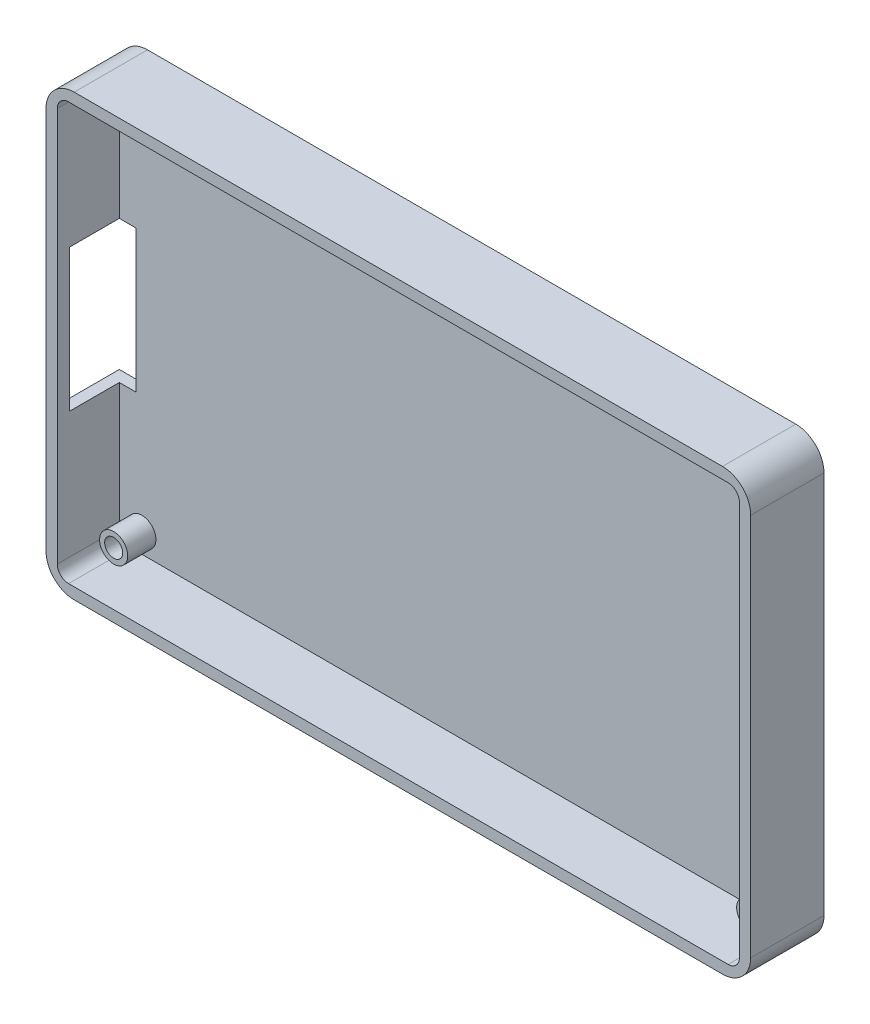
ISO-10303-21;
HEADER;
FILE_DESCRIPTION(('STEP AP214'),'2;1');
FILE_NAME('part.step','',(''),(''),'','','');
FILE_SCHEMA(('AUTOMOTIVE_DESIGN { 1 0 10303 214 1 1 1 1 }'));
ENDSEC;
DATA;
#1=APPLICATION_CONTEXT('core data for automotive mechanical design processes');
#2=APPLICATION_PROTOCOL_DEFINITION('international standard','automotive_design',2000,#1);
#3=PRODUCT_CONTEXT('',#1,'mechanical');
#4=PRODUCT('Part','Part','',(#3));
#5=PRODUCT_RELATED_PRODUCT_CATEGORY('part','',(#4));
#6=PRODUCT_DEFINITION_FORMATION('','',#4);
#7=PRODUCT_DEFINITION_CONTEXT('part definition',#1,'design');
#8=PRODUCT_DEFINITION('design','',#6,#7);
#9=PRODUCT_DEFINITION_SHAPE('','',#8);
#10=(LENGTH_UNIT() NAMED_UNIT(*) SI_UNIT(.MILLI.,.METRE.));
#11=(NAMED_UNIT(*) PLANE_ANGLE_UNIT() SI_UNIT($,.RADIAN.));
#12=(NAMED_UNIT(*) SI_UNIT($,.STERADIAN.) SOLID_ANGLE_UNIT());
#13=UNCERTAINTY_MEASURE_WITH_UNIT(LENGTH_MEASURE(1.E-05),#10,'distance_accuracy_value','');
#14=(GEOMETRIC_REPRESENTATION_CONTEXT(3) GLOBAL_UNCERTAINTY_ASSIGNED_CONTEXT((#13)) GLOBAL_UNIT_ASSIGNED_CONTEXT((#10,
#11,#12)) REPRESENTATION_CONTEXT('',''));
#15=CARTESIAN_POINT('',(0.,0.,0.));
#16=DIRECTION('',(0.,0.,1.));
#17=DIRECTION('',(1.,0.,0.));
#18=AXIS2_PLACEMENT_3D('',#15,#16,#17);
#19=CARTESIAN_POINT('',(0.,0.,13.));
#20=DIRECTION('',(0.,0.,1.));
#21=DIRECTION('',(1.,0.,0.));
#22=AXIS2_PLACEMENT_3D('',#19,#20,#21);
#23=PLANE('',#22);
#24=DIRECTION('',(1.,0.,0.));
#25=VECTOR('',#24,1.);
#26=CARTESIAN_POINT('',(0.,-39.,13.));
#27=LINE('',#26,#25);
#28=CARTESIAN_POINT('',(-57.5,-39.,13.));
#29=VERTEX_POINT('',#28);
#30=CARTESIAN_POINT('',(57.5,-39.,13.));
#31=VERTEX_POINT('',#30);
#32=EDGE_CURVE('E332',#29,#31,#27,.T.);
#33=ORIENTED_EDGE('',*,*,#32,.T.);
#34=CARTESIAN_POINT('',(57.5,-34.,13.));
#35=DIRECTION('',(0.,0.,1.));
#36=DIRECTION('',(1.,0.,0.));
#37=AXIS2_PLACEMENT_3D('',#34,#35,#36);
#38=CIRCLE('',#37,5.);
#39=CARTESIAN_POINT('',(62.5,-34.,13.));
#40=VERTEX_POINT('',#39);
#41=EDGE_CURVE('E387',#31,#40,#38,.T.);
#42=ORIENTED_EDGE('',*,*,#41,.T.);
#43=DIRECTION('',(0.,-1.,0.));
#44=VECTOR('',#43,1.);
#45=CARTESIAN_POINT('',(62.5,0.,13.));
#46=LINE('',#45,#44);
#47=CARTESIAN_POINT('',(62.5,34.,13.));
#48=VERTEX_POINT('',#47);
#49=EDGE_CURVE('E322',#48,#40,#46,.T.);
#50=ORIENTED_EDGE('',*,*,#49,.F.);
#51=CARTESIAN_POINT('',(57.5,34.,13.));
#52=DIRECTION('',(0.,0.,1.));
#53=DIRECTION('',(1.,0.,0.));
#54=AXIS2_PLACEMENT_3D('',#51,#52,#53);
#55=CIRCLE('',#54,5.);
#56=CARTESIAN_POINT('',(57.5,39.,13.));
#57=VERTEX_POINT('',#56);
#58=EDGE_CURVE('E381',#48,#57,#55,.T.);
#59=ORIENTED_EDGE('',*,*,#58,.T.);
#60=DIRECTION('',(1.,0.,0.));
#61=VECTOR('',#60,1.);
#62=CARTESIAN_POINT('',(0.,39.,13.));
#63=LINE('',#62,#61);
#64=CARTESIAN_POINT('',(-57.5,39.,13.));
#65=VERTEX_POINT('',#64);
#66=EDGE_CURVE('E325',#65,#57,#63,.T.);
#67=ORIENTED_EDGE('',*,*,#66,.F.);
#68=CARTESIAN_POINT('',(-57.5,34.,13.));
#69=DIRECTION('',(0.,0.,1.));
#70=DIRECTION('',(1.,0.,0.));
#71=AXIS2_PLACEMENT_3D('',#68,#69,#70);
#72=CIRCLE('',#71,5.);
#73=CARTESIAN_POINT('',(-62.5,34.,13.));
#74=VERTEX_POINT('',#73);
#75=EDGE_CURVE('E383',#65,#74,#72,.T.);
#76=ORIENTED_EDGE('',*,*,#75,.T.);
#77=DIRECTION('',(0.,-1.,0.));
#78=VECTOR('',#77,1.);
#79=CARTESIAN_POINT('',(-62.5,0.,13.));
#80=LINE('',#79,#78);
#81=CARTESIAN_POINT('',(-62.5,-34.,13.));
#82=VERTEX_POINT('',#81);
#83=EDGE_CURVE('E329',#74,#82,#80,.T.);
#84=ORIENTED_EDGE('',*,*,#83,.T.);
#85=CARTESIAN_POINT('',(-57.5,-34.,13.));
#86=DIRECTION('',(0.,0.,1.));
#87=DIRECTION('',(1.,0.,0.));
#88=AXIS2_PLACEMENT_3D('',#85,#86,#87);
#89=CIRCLE('',#88,5.);
#90=EDGE_CURVE('E385',#82,#29,#89,.T.);
#91=ORIENTED_EDGE('',*,*,#90,.T.);
#92=EDGE_LOOP('',(#33,#42,#50,#59,#67,#76,#84,#91));
#93=FACE_BOUND('',#92,.T.);
#94=DIRECTION('',(0.,-1.,0.));
#95=VECTOR('',#94,1.);
#96=CARTESIAN_POINT('',(-60.5,0.,13.));
#97=LINE('',#96,#95);
#98=CARTESIAN_POINT('',(-60.5,35.,13.));
#99=VERTEX_POINT('',#98);
#100=CARTESIAN_POINT('',(-60.5,-35.,13.));
#101=VERTEX_POINT('',#100);
#102=EDGE_CURVE('E311',#99,#101,#97,.T.);
#103=ORIENTED_EDGE('',*,*,#102,.F.);
#104=CARTESIAN_POINT('',(-58.5,35.,13.));
#105=DIRECTION('',(0.,0.,1.));
#106=DIRECTION('',(1.,0.,0.));
#107=AXIS2_PLACEMENT_3D('',#104,#105,#106);
#108=CIRCLE('',#107,2.);
#109=CARTESIAN_POINT('',(-58.5,37.,13.));
#110=VERTEX_POINT('',#109);
#111=EDGE_CURVE('E12',#99,#110,#108,.F.);
#112=ORIENTED_EDGE('',*,*,#111,.T.);
#113=DIRECTION('',(1.,0.,0.));
#114=VECTOR('',#113,1.);
#115=CARTESIAN_POINT('',(0.,37.,13.));
#116=LINE('',#115,#114);
#117=CARTESIAN_POINT('',(58.5,37.,13.));
#118=VERTEX_POINT('',#117);
#119=EDGE_CURVE('E314',#110,#118,#116,.T.);
#120=ORIENTED_EDGE('',*,*,#119,.T.);
#121=CARTESIAN_POINT('',(58.5,35.,13.));
#122=DIRECTION('',(0.,0.,1.));
#123=DIRECTION('',(1.,0.,0.));
#124=AXIS2_PLACEMENT_3D('',#121,#122,#123);
#125=CIRCLE('',#124,2.);
#126=CARTESIAN_POINT('',(60.5,35.,13.));
#127=VERTEX_POINT('',#126);
#128=EDGE_CURVE('E426',#118,#127,#125,.F.);
#129=ORIENTED_EDGE('',*,*,#128,.T.);
#130=DIRECTION('',(0.,-1.,0.));
#131=VECTOR('',#130,1.);
#132=CARTESIAN_POINT('',(60.5,0.,13.));
#133=LINE('',#132,#131);
#134=CARTESIAN_POINT('',(60.5,-35.,13.));
#135=VERTEX_POINT('',#134);
#136=EDGE_CURVE('E305',#127,#135,#133,.T.);
#137=ORIENTED_EDGE('',*,*,#136,.T.);
#138=CARTESIAN_POINT('',(58.5,-35.,13.));
#139=DIRECTION('',(0.,0.,1.));
#140=DIRECTION('',(1.,0.,0.));
#141=AXIS2_PLACEMENT_3D('',#138,#139,#140);
#142=CIRCLE('',#141,2.);
#143=CARTESIAN_POINT('',(58.5,-37.,13.));
#144=VERTEX_POINT('',#143);
#145=EDGE_CURVE('E428',#135,#144,#142,.F.);
#146=ORIENTED_EDGE('',*,*,#145,.T.);
#147=DIRECTION('',(1.,0.,0.));
#148=VECTOR('',#147,1.);
#149=CARTESIAN_POINT('',(0.,-37.,13.));
#150=LINE('',#149,#148);
#151=CARTESIAN_POINT('',(-58.5,-37.,13.));
#152=VERTEX_POINT('',#151);
#153=EDGE_CURVE('E313',#152,#144,#150,.T.);
#154=ORIENTED_EDGE('',*,*,#153,.F.);
#155=CARTESIAN_POINT('',(-58.5,-35.,13.));
#156=DIRECTION('',(0.,0.,1.));
#157=DIRECTION('',(1.,0.,0.));
#158=AXIS2_PLACEMENT_3D('',#155,#156,#157);
#159=CIRCLE('',#158,2.);
#160=EDGE_CURVE('E75',#152,#101,#159,.F.);
#161=ORIENTED_EDGE('',*,*,#160,.T.);
#162=EDGE_LOOP('',(#103,#112,#120,#129,#137,#146,#154,#161));
#163=FACE_BOUND('',#162,.T.);
#164=ADVANCED_FACE('F67',(#93,#163),#23,.T.);
#165=CARTESIAN_POINT('',(0.,0.,0.));
#166=DIRECTION('',(0.,0.,1.));
#167=DIRECTION('',(1.,0.,0.));
#168=AXIS2_PLACEMENT_3D('',#165,#166,#167);
#169=PLANE('',#168);
#170=DIRECTION('',(0.,-1.,0.));
#171=VECTOR('',#170,1.);
#172=CARTESIAN_POINT('',(62.5,0.,0.));
#173=LINE('',#172,#171);
#174=CARTESIAN_POINT('',(62.5,34.,0.));
#175=VERTEX_POINT('',#174);
#176=CARTESIAN_POINT('',(62.5,-34.,0.));
#177=VERTEX_POINT('',#176);
#178=EDGE_CURVE('E317',#175,#177,#173,.T.);
#179=ORIENTED_EDGE('',*,*,#178,.T.);
#180=CARTESIAN_POINT('',(57.5,-34.,0.));
#181=DIRECTION('',(0.,0.,1.));
#182=DIRECTION('',(1.,0.,0.));
#183=AXIS2_PLACEMENT_3D('',#180,#181,#182);
#184=CIRCLE('',#183,5.);
#185=CARTESIAN_POINT('',(57.5,-39.,0.));
#186=VERTEX_POINT('',#185);
#187=EDGE_CURVE('E374',#177,#186,#184,.F.);
#188=ORIENTED_EDGE('',*,*,#187,.T.);
#189=DIRECTION('',(1.,0.,0.));
#190=VECTOR('',#189,1.);
#191=CARTESIAN_POINT('',(0.,-39.,0.));
#192=LINE('',#191,#190);
#193=CARTESIAN_POINT('',(-57.5,-39.,0.));
#194=VERTEX_POINT('',#193);
#195=EDGE_CURVE('E326',#194,#186,#192,.T.);
#196=ORIENTED_EDGE('',*,*,#195,.F.);
#197=CARTESIAN_POINT('',(-57.5,-34.,0.));
#198=DIRECTION('',(0.,0.,1.));
#199=DIRECTION('',(1.,0.,0.));
#200=AXIS2_PLACEMENT_3D('',#197,#198,#199);
#201=CIRCLE('',#200,5.);
#202=CARTESIAN_POINT('',(-62.5,-34.,0.));
#203=VERTEX_POINT('',#202);
#204=EDGE_CURVE('E372',#194,#203,#201,.F.);
#205=ORIENTED_EDGE('',*,*,#204,.T.);
#206=DIRECTION('',(0.,-1.,0.));
#207=VECTOR('',#206,1.);
#208=CARTESIAN_POINT('',(-62.5,0.,0.));
#209=LINE('',#208,#207);
#210=CARTESIAN_POINT('',(-62.5,-12.6031682700395,0.));
#211=VERTEX_POINT('',#210);
#212=EDGE_CURVE('E340',#211,#203,#209,.T.);
#213=ORIENTED_EDGE('',*,*,#212,.F.);
#214=DIRECTION('',(-1.,0.,0.));
#215=VECTOR('',#214,1.);
#216=CARTESIAN_POINT('',(-57.5,-12.6031682700395,0.));
#217=LINE('',#216,#215);
#218=CARTESIAN_POINT('',(-57.5,-12.6031682700395,0.));
#219=VERTEX_POINT('',#218);
#220=EDGE_CURVE('E239',#219,#211,#217,.T.);
#221=ORIENTED_EDGE('',*,*,#220,.F.);
#222=DIRECTION('',(0.,-1.,0.));
#223=VECTOR('',#222,1.);
#224=CARTESIAN_POINT('',(-57.5,12.6031682700396,0.));
#225=LINE('',#224,#223);
#226=CARTESIAN_POINT('',(-57.5,12.6031682700396,0.));
#227=VERTEX_POINT('',#226);
#228=EDGE_CURVE('E221',#227,#219,#225,.T.);
#229=ORIENTED_EDGE('',*,*,#228,.F.);
#230=DIRECTION('',(-1.,0.,0.));
#231=VECTOR('',#230,1.);
#232=CARTESIAN_POINT('',(-57.5,12.6031682700396,0.));
#233=LINE('',#232,#231);
#234=CARTESIAN_POINT('',(-62.5,12.6031682700396,0.));
#235=VERTEX_POINT('',#234);
#236=EDGE_CURVE('E232',#227,#235,#233,.T.);
#237=ORIENTED_EDGE('',*,*,#236,.T.);
#238=CARTESIAN_POINT('',(-62.5,34.,0.));
#239=VERTEX_POINT('',#238);
#240=EDGE_CURVE('E341',#239,#235,#209,.T.);
#241=ORIENTED_EDGE('',*,*,#240,.F.);
#242=CARTESIAN_POINT('',(-57.5,34.,0.));
#243=DIRECTION('',(0.,0.,1.));
#244=DIRECTION('',(1.,0.,0.));
#245=AXIS2_PLACEMENT_3D('',#242,#243,#244);
#246=CIRCLE('',#245,5.);
#247=CARTESIAN_POINT('',(-57.5,39.,0.));
#248=VERTEX_POINT('',#247);
#249=EDGE_CURVE('E370',#239,#248,#246,.F.);
#250=ORIENTED_EDGE('',*,*,#249,.T.);
#251=DIRECTION('',(1.,0.,0.));
#252=VECTOR('',#251,1.);
#253=CARTESIAN_POINT('',(0.,39.,0.));
#254=LINE('',#253,#252);
#255=CARTESIAN_POINT('',(57.5,39.,0.));
#256=VERTEX_POINT('',#255);
#257=EDGE_CURVE('E337',#248,#256,#254,.T.);
#258=ORIENTED_EDGE('',*,*,#257,.T.);
#259=CARTESIAN_POINT('',(57.5,34.,0.));
#260=DIRECTION('',(0.,0.,1.));
#261=DIRECTION('',(1.,0.,0.));
#262=AXIS2_PLACEMENT_3D('',#259,#260,#261);
#263=CIRCLE('',#262,5.);
#264=EDGE_CURVE('E368',#256,#175,#263,.F.);
#265=ORIENTED_EDGE('',*,*,#264,.T.);
#266=EDGE_LOOP('',(#179,#188,#196,#205,#213,#221,#229,#237,#241,#250,#258,#265));
#267=FACE_BOUND('',#266,.T.);
#268=ADVANCED_FACE('F243',(#267),#169,.F.);
#269=CARTESIAN_POINT('',(-62.5,0.,13.));
#270=DIRECTION('',(1.,0.,0.));
#271=DIRECTION('',(0.,0.,-1.));
#272=AXIS2_PLACEMENT_3D('',#269,#270,#271);
#273=PLANE('',#272);
#274=ORIENTED_EDGE('',*,*,#212,.T.);
#275=DIRECTION('',(0.,0.,-1.));
#276=VECTOR('',#275,1.);
#277=CARTESIAN_POINT('',(-62.5,-34.,13.));
#278=LINE('',#277,#276);
#279=EDGE_CURVE('E392',#203,#82,#278,.F.);
#280=ORIENTED_EDGE('',*,*,#279,.T.);
#281=ORIENTED_EDGE('',*,*,#83,.F.);
#282=DIRECTION('',(0.,0.,-1.));
#283=VECTOR('',#282,1.);
#284=CARTESIAN_POINT('',(-62.5,34.,0.));
#285=LINE('',#284,#283);
#286=EDGE_CURVE('E389',#74,#239,#285,.T.);
#287=ORIENTED_EDGE('',*,*,#286,.T.);
#288=ORIENTED_EDGE('',*,*,#240,.T.);
#289=DIRECTION('',(0.,0.,-1.));
#290=VECTOR('',#289,1.);
#291=CARTESIAN_POINT('',(-62.5,12.6031682700396,2.13842205853658));
#292=LINE('',#291,#290);
#293=CARTESIAN_POINT('',(-62.5,12.6031682700396,10.8615779414634));
#294=VERTEX_POINT('',#293);
#295=EDGE_CURVE('E236',#294,#235,#292,.T.);
#296=ORIENTED_EDGE('',*,*,#295,.F.);
#297=DIRECTION('',(0.,1.,0.));
#298=VECTOR('',#297,1.);
#299=CARTESIAN_POINT('',(-62.5,12.6031682700396,10.8615779414634));
#300=LINE('',#299,#298);
#301=CARTESIAN_POINT('',(-62.5,-12.6031682700395,10.8615779414634));
#302=VERTEX_POINT('',#301);
#303=EDGE_CURVE('E249',#302,#294,#300,.T.);
#304=ORIENTED_EDGE('',*,*,#303,.F.);
#305=DIRECTION('',(0.,0.,1.));
#306=VECTOR('',#305,1.);
#307=CARTESIAN_POINT('',(-62.5,-12.6031682700395,2.13842205853658));
#308=LINE('',#307,#306);
#309=EDGE_CURVE('E228',#211,#302,#308,.T.);
#310=ORIENTED_EDGE('',*,*,#309,.F.);
#311=EDGE_LOOP('',(#274,#280,#281,#287,#288,#296,#304,#310));
#312=FACE_BOUND('',#311,.T.);
#313=ADVANCED_FACE('F469',(#312),#273,.F.);
#314=CARTESIAN_POINT('',(0.,39.,13.));
#315=DIRECTION('',(0.,1.,0.));
#316=DIRECTION('',(0.,0.,1.));
#317=AXIS2_PLACEMENT_3D('',#314,#315,#316);
#318=PLANE('',#317);
#319=ORIENTED_EDGE('',*,*,#257,.F.);
#320=DIRECTION('',(0.,0.,-1.));
#321=VECTOR('',#320,1.);
#322=CARTESIAN_POINT('',(-57.5,39.,13.));
#323=LINE('',#322,#321);
#324=EDGE_CURVE('E397',#248,#65,#323,.F.);
#325=ORIENTED_EDGE('',*,*,#324,.T.);
#326=ORIENTED_EDGE('',*,*,#66,.T.);
#327=DIRECTION('',(0.,0.,-1.));
#328=VECTOR('',#327,1.);
#329=CARTESIAN_POINT('',(57.5,39.,13.));
#330=LINE('',#329,#328);
#331=EDGE_CURVE('E394',#57,#256,#330,.T.);
#332=ORIENTED_EDGE('',*,*,#331,.T.);
#333=EDGE_LOOP('',(#319,#325,#326,#332));
#334=FACE_BOUND('',#333,.T.);
#335=ADVANCED_FACE('F476',(#334),#318,.T.);
#336=CARTESIAN_POINT('',(62.5,0.,13.));
#337=DIRECTION('',(1.,0.,0.));
#338=DIRECTION('',(0.,1.,0.));
#339=AXIS2_PLACEMENT_3D('',#336,#337,#338);
#340=PLANE('',#339);
#341=ORIENTED_EDGE('',*,*,#49,.T.);
#342=DIRECTION('',(0.,0.,-1.));
#343=VECTOR('',#342,1.);
#344=CARTESIAN_POINT('',(62.5,-34.,0.));
#345=LINE('',#344,#343);
#346=EDGE_CURVE('E365',#40,#177,#345,.T.);
#347=ORIENTED_EDGE('',*,*,#346,.T.);
#348=ORIENTED_EDGE('',*,*,#178,.F.);
#349=DIRECTION('',(0.,0.,-1.));
#350=VECTOR('',#349,1.);
#351=CARTESIAN_POINT('',(62.5,34.,13.));
#352=LINE('',#351,#350);
#353=EDGE_CURVE('E363',#175,#48,#352,.F.);
#354=ORIENTED_EDGE('',*,*,#353,.T.);
#355=EDGE_LOOP('',(#341,#347,#348,#354));
#356=FACE_BOUND('',#355,.T.);
#357=ADVANCED_FACE('F499',(#356),#340,.T.);
#358=CARTESIAN_POINT('',(0.,-39.,13.));
#359=DIRECTION('',(0.,1.,0.));
#360=DIRECTION('',(0.,0.,1.));
#361=AXIS2_PLACEMENT_3D('',#358,#359,#360);
#362=PLANE('',#361);
#363=ORIENTED_EDGE('',*,*,#195,.T.);
#364=DIRECTION('',(0.,0.,-1.));
#365=VECTOR('',#364,1.);
#366=CARTESIAN_POINT('',(57.5,-39.,13.));
#367=LINE('',#366,#365);
#368=EDGE_CURVE('E379',#186,#31,#367,.F.);
#369=ORIENTED_EDGE('',*,*,#368,.T.);
#370=ORIENTED_EDGE('',*,*,#32,.F.);
#371=DIRECTION('',(0.,0.,-1.));
#372=VECTOR('',#371,1.);
#373=CARTESIAN_POINT('',(-57.5,-39.,13.));
#374=LINE('',#373,#372);
#375=EDGE_CURVE('E376',#29,#194,#374,.T.);
#376=ORIENTED_EDGE('',*,*,#375,.T.);
#377=EDGE_LOOP('',(#363,#369,#370,#376));
#378=FACE_BOUND('',#377,.T.);
#379=ADVANCED_FACE('F490',(#378),#362,.F.);
#380=CARTESIAN_POINT('',(0.,0.,2.));
#381=DIRECTION('',(0.,0.,1.));
#382=DIRECTION('',(1.,0.,0.));
#383=AXIS2_PLACEMENT_3D('',#380,#381,#382);
#384=PLANE('',#383);
#385=DIRECTION('',(0.,-1.,0.));
#386=VECTOR('',#385,1.);
#387=CARTESIAN_POINT('',(60.5,0.,2.));
#388=LINE('',#387,#386);
#389=CARTESIAN_POINT('',(60.5,35.,2.));
#390=VERTEX_POINT('',#389);
#391=CARTESIAN_POINT('',(60.5,-35.,2.));
#392=VERTEX_POINT('',#391);
#393=EDGE_CURVE('E296',#390,#392,#388,.T.);
#394=ORIENTED_EDGE('',*,*,#393,.F.);
#395=CARTESIAN_POINT('',(58.5,35.,2.));
#396=DIRECTION('',(0.,0.,1.));
#397=DIRECTION('',(1.,0.,0.));
#398=AXIS2_PLACEMENT_3D('',#395,#396,#397);
#399=CIRCLE('',#398,2.);
#400=CARTESIAN_POINT('',(58.5,37.,2.));
#401=VERTEX_POINT('',#400);
#402=EDGE_CURVE('E410',#390,#401,#399,.T.);
#403=ORIENTED_EDGE('',*,*,#402,.T.);
#404=DIRECTION('',(1.,0.,0.));
#405=VECTOR('',#404,1.);
#406=CARTESIAN_POINT('',(0.,37.,2.));
#407=LINE('',#406,#405);
#408=CARTESIAN_POINT('',(-58.5,37.,2.));
#409=VERTEX_POINT('',#408);
#410=EDGE_CURVE('E301',#409,#401,#407,.T.);
#411=ORIENTED_EDGE('',*,*,#410,.F.);
#412=CARTESIAN_POINT('',(-58.5,35.,2.));
#413=DIRECTION('',(0.,0.,1.));
#414=DIRECTION('',(1.,0.,0.));
#415=AXIS2_PLACEMENT_3D('',#412,#413,#414);
#416=CIRCLE('',#415,2.);
#417=CARTESIAN_POINT('',(-60.5,35.,2.));
#418=VERTEX_POINT('',#417);
#419=EDGE_CURVE('E404',#409,#418,#416,.T.);
#420=ORIENTED_EDGE('',*,*,#419,.T.);
#421=DIRECTION('',(0.,-1.,0.));
#422=VECTOR('',#421,1.);
#423=CARTESIAN_POINT('',(-60.5,0.,2.));
#424=LINE('',#423,#422);
#425=CARTESIAN_POINT('',(-60.5,12.6031682700396,2.));
#426=VERTEX_POINT('',#425);
#427=EDGE_CURVE('E306',#418,#426,#424,.T.);
#428=ORIENTED_EDGE('',*,*,#427,.T.);
#429=DIRECTION('',(-1.,0.,0.));
#430=VECTOR('',#429,1.);
#431=CARTESIAN_POINT('',(0.,12.6031682700396,2.));
#432=LINE('',#431,#430);
#433=CARTESIAN_POINT('',(-57.5,12.6031682700396,2.));
#434=VERTEX_POINT('',#433);
#435=EDGE_CURVE('E256',#434,#426,#432,.T.);
#436=ORIENTED_EDGE('',*,*,#435,.F.);
#437=DIRECTION('',(0.,-1.,0.));
#438=VECTOR('',#437,1.);
#439=CARTESIAN_POINT('',(-57.5,0.,2.));
#440=LINE('',#439,#438);
#441=CARTESIAN_POINT('',(-57.5,-12.6031682700395,2.));
#442=VERTEX_POINT('',#441);
#443=EDGE_CURVE('E224',#434,#442,#440,.T.);
#444=ORIENTED_EDGE('',*,*,#443,.T.);
#445=DIRECTION('',(1.,0.,0.));
#446=VECTOR('',#445,1.);
#447=CARTESIAN_POINT('',(0.,-12.6031682700395,2.));
#448=LINE('',#447,#446);
#449=CARTESIAN_POINT('',(-60.5,-12.6031682700395,2.));
#450=VERTEX_POINT('',#449);
#451=EDGE_CURVE('E260',#450,#442,#448,.T.);
#452=ORIENTED_EDGE('',*,*,#451,.F.);
#453=CARTESIAN_POINT('',(-60.5,-35.,2.));
#454=VERTEX_POINT('',#453);
#455=EDGE_CURVE('E308',#450,#454,#424,.T.);
#456=ORIENTED_EDGE('',*,*,#455,.T.);
#457=CARTESIAN_POINT('',(-58.5,-35.,2.));
#458=DIRECTION('',(0.,0.,1.));
#459=DIRECTION('',(1.,0.,0.));
#460=AXIS2_PLACEMENT_3D('',#457,#458,#459);
#461=CIRCLE('',#460,2.);
#462=CARTESIAN_POINT('',(-58.5,-37.,2.));
#463=VERTEX_POINT('',#462);
#464=EDGE_CURVE('E406',#454,#463,#461,.T.);
#465=ORIENTED_EDGE('',*,*,#464,.T.);
#466=DIRECTION('',(1.,0.,0.));
#467=VECTOR('',#466,1.);
#468=CARTESIAN_POINT('',(0.,-37.,2.));
#469=LINE('',#468,#467);
#470=CARTESIAN_POINT('',(58.5,-37.,2.));
#471=VERTEX_POINT('',#470);
#472=EDGE_CURVE('E302',#463,#471,#469,.T.);
#473=ORIENTED_EDGE('',*,*,#472,.T.);
#474=CARTESIAN_POINT('',(58.5,-35.,2.));
#475=DIRECTION('',(0.,0.,1.));
#476=DIRECTION('',(1.,0.,0.));
#477=AXIS2_PLACEMENT_3D('',#474,#475,#476);
#478=CIRCLE('',#477,2.);
#479=EDGE_CURVE('E408',#471,#392,#478,.T.);
#480=ORIENTED_EDGE('',*,*,#479,.T.);
#481=EDGE_LOOP('',(#394,#403,#411,#420,#428,#436,#444,#452,#456,#465,#473,#480));
#482=FACE_BOUND('',#481,.T.);
#483=CARTESIAN_POINT('',(-56.5,-33.5,2.));
#484=DIRECTION('',(0.,0.,1.));
#485=DIRECTION('',(-1.,0.,0.));
#486=AXIS2_PLACEMENT_3D('',#483,#484,#485);
#487=CIRCLE('',#486,2.5);
#488=CARTESIAN_POINT('',(-59.,-33.5,2.));
#489=VERTEX_POINT('',#488);
#490=EDGE_CURVE('E263',#489,#489,#487,.T.);
#491=ORIENTED_EDGE('',*,*,#490,.F.);
#492=EDGE_LOOP('',(#491));
#493=FACE_BOUND('',#492,.T.);
#494=CARTESIAN_POINT('',(56.5,-33.5,2.));
#495=DIRECTION('',(0.,0.,1.));
#496=DIRECTION('',(1.,0.,0.));
#497=AXIS2_PLACEMENT_3D('',#494,#495,#496);
#498=CIRCLE('',#497,2.5);
#499=CARTESIAN_POINT('',(59.,-33.5,2.));
#500=VERTEX_POINT('',#499);
#501=EDGE_CURVE('E272',#500,#500,#498,.T.);
#502=ORIENTED_EDGE('',*,*,#501,.F.);
#503=EDGE_LOOP('',(#502));
#504=FACE_BOUND('',#503,.T.);
#505=CARTESIAN_POINT('',(56.5,33.5,2.));
#506=DIRECTION('',(0.,0.,1.));
#507=DIRECTION('',(-1.,0.,0.));
#508=AXIS2_PLACEMENT_3D('',#505,#506,#507);
#509=CIRCLE('',#508,2.5);
#510=CARTESIAN_POINT('',(54.,33.5,2.));
#511=VERTEX_POINT('',#510);
#512=EDGE_CURVE('E281',#511,#511,#509,.T.);
#513=ORIENTED_EDGE('',*,*,#512,.F.);
#514=EDGE_LOOP('',(#513));
#515=FACE_BOUND('',#514,.T.);
#516=CARTESIAN_POINT('',(-56.5,33.5,2.));
#517=DIRECTION('',(0.,0.,1.));
#518=DIRECTION('',(1.,0.,0.));
#519=AXIS2_PLACEMENT_3D('',#516,#517,#518);
#520=CIRCLE('',#519,2.5);
#521=CARTESIAN_POINT('',(-54.,33.5,2.));
#522=VERTEX_POINT('',#521);
#523=EDGE_CURVE('E292',#522,#522,#520,.T.);
#524=ORIENTED_EDGE('',*,*,#523,.F.);
#525=EDGE_LOOP('',(#524));
#526=FACE_BOUND('',#525,.T.);
#527=ADVANCED_FACE('F441',(#482,#493,#504,#515,#526),#384,.T.);
#528=CARTESIAN_POINT('',(-60.5,0.,13.));
#529=DIRECTION('',(1.,0.,0.));
#530=DIRECTION('',(0.,0.,-1.));
#531=AXIS2_PLACEMENT_3D('',#528,#529,#530);
#532=PLANE('',#531);
#533=ORIENTED_EDGE('',*,*,#102,.T.);
#534=DIRECTION('',(0.,0.,-1.));
#535=VECTOR('',#534,1.);
#536=CARTESIAN_POINT('',(-60.5,-35.,2.));
#537=LINE('',#536,#535);
#538=EDGE_CURVE('E423',#101,#454,#537,.T.);
#539=ORIENTED_EDGE('',*,*,#538,.T.);
#540=ORIENTED_EDGE('',*,*,#455,.F.);
#541=DIRECTION('',(0.,0.,-1.));
#542=VECTOR('',#541,1.);
#543=CARTESIAN_POINT('',(-60.5,-12.6031682700395,13.));
#544=LINE('',#543,#542);
#545=CARTESIAN_POINT('',(-60.5,-12.6031682700395,10.8615779414634));
#546=VERTEX_POINT('',#545);
#547=EDGE_CURVE('E360',#546,#450,#544,.T.);
#548=ORIENTED_EDGE('',*,*,#547,.F.);
#549=DIRECTION('',(0.,-1.,0.));
#550=VECTOR('',#549,1.);
#551=CARTESIAN_POINT('',(-60.5,0.,10.8615779414634));
#552=LINE('',#551,#550);
#553=CARTESIAN_POINT('',(-60.5,12.6031682700396,10.8615779414634));
#554=VERTEX_POINT('',#553);
#555=EDGE_CURVE('E358',#554,#546,#552,.T.);
#556=ORIENTED_EDGE('',*,*,#555,.F.);
#557=DIRECTION('',(0.,0.,1.));
#558=VECTOR('',#557,1.);
#559=CARTESIAN_POINT('',(-60.5,12.6031682700396,13.));
#560=LINE('',#559,#558);
#561=EDGE_CURVE('E356',#426,#554,#560,.T.);
#562=ORIENTED_EDGE('',*,*,#561,.F.);
#563=ORIENTED_EDGE('',*,*,#427,.F.);
#564=DIRECTION('',(0.,0.,-1.));
#565=VECTOR('',#564,1.);
#566=CARTESIAN_POINT('',(-60.5,35.,13.));
#567=LINE('',#566,#565);
#568=EDGE_CURVE('E88',#418,#99,#567,.F.);
#569=ORIENTED_EDGE('',*,*,#568,.T.);
#570=EDGE_LOOP('',(#533,#539,#540,#548,#556,#562,#563,#569));
#571=FACE_BOUND('',#570,.T.);
#572=ADVANCED_FACE('F458',(#571),#532,.T.);
#573=CARTESIAN_POINT('',(0.,37.,13.));
#574=DIRECTION('',(0.,1.,0.));
#575=DIRECTION('',(0.,0.,1.));
#576=AXIS2_PLACEMENT_3D('',#573,#574,#575);
#577=PLANE('',#576);
#578=ORIENTED_EDGE('',*,*,#410,.T.);
#579=DIRECTION('',(0.,0.,-1.));
#580=VECTOR('',#579,1.);
#581=CARTESIAN_POINT('',(58.5,37.,13.));
#582=LINE('',#581,#580);
#583=EDGE_CURVE('E415',#401,#118,#582,.F.);
#584=ORIENTED_EDGE('',*,*,#583,.T.);
#585=ORIENTED_EDGE('',*,*,#119,.F.);
#586=DIRECTION('',(0.,0.,-1.));
#587=VECTOR('',#586,1.);
#588=CARTESIAN_POINT('',(-58.5,37.,13.));
#589=LINE('',#588,#587);
#590=EDGE_CURVE('E412',#110,#409,#589,.T.);
#591=ORIENTED_EDGE('',*,*,#590,.T.);
#592=EDGE_LOOP('',(#578,#584,#585,#591));
#593=FACE_BOUND('',#592,.T.);
#594=ADVANCED_FACE('F452',(#593),#577,.F.);
#595=CARTESIAN_POINT('',(60.5,0.,13.));
#596=DIRECTION('',(1.,0.,0.));
#597=DIRECTION('',(0.,1.,0.));
#598=AXIS2_PLACEMENT_3D('',#595,#596,#597);
#599=PLANE('',#598);
#600=ORIENTED_EDGE('',*,*,#136,.F.);
#601=DIRECTION('',(0.,0.,-1.));
#602=VECTOR('',#601,1.);
#603=CARTESIAN_POINT('',(60.5,35.,2.));
#604=LINE('',#603,#602);
#605=EDGE_CURVE('E401',#127,#390,#604,.T.);
#606=ORIENTED_EDGE('',*,*,#605,.T.);
#607=ORIENTED_EDGE('',*,*,#393,.T.);
#608=DIRECTION('',(0.,0.,-1.));
#609=VECTOR('',#608,1.);
#610=CARTESIAN_POINT('',(60.5,-35.,13.));
#611=LINE('',#610,#609);
#612=EDGE_CURVE('E399',#392,#135,#611,.F.);
#613=ORIENTED_EDGE('',*,*,#612,.T.);
#614=EDGE_LOOP('',(#600,#606,#607,#613));
#615=FACE_BOUND('',#614,.T.);
#616=ADVANCED_FACE('F444',(#615),#599,.F.);
#617=CARTESIAN_POINT('',(0.,-37.,13.));
#618=DIRECTION('',(0.,1.,0.));
#619=DIRECTION('',(0.,0.,1.));
#620=AXIS2_PLACEMENT_3D('',#617,#618,#619);
#621=PLANE('',#620);
#622=ORIENTED_EDGE('',*,*,#153,.T.);
#623=DIRECTION('',(0.,0.,-1.));
#624=VECTOR('',#623,1.);
#625=CARTESIAN_POINT('',(58.5,-37.,13.));
#626=LINE('',#625,#624);
#627=EDGE_CURVE('E419',#144,#471,#626,.T.);
#628=ORIENTED_EDGE('',*,*,#627,.T.);
#629=ORIENTED_EDGE('',*,*,#472,.F.);
#630=DIRECTION('',(0.,0.,-1.));
#631=VECTOR('',#630,1.);
#632=CARTESIAN_POINT('',(-58.5,-37.,13.));
#633=LINE('',#632,#631);
#634=EDGE_CURVE('E417',#463,#152,#633,.F.);
#635=ORIENTED_EDGE('',*,*,#634,.T.);
#636=EDGE_LOOP('',(#622,#628,#629,#635));
#637=FACE_BOUND('',#636,.T.);
#638=ADVANCED_FACE('F435',(#637),#621,.T.);
#639=CARTESIAN_POINT('',(-56.5,33.5,7.));
#640=DIRECTION('',(0.,0.,1.));
#641=DIRECTION('',(1.,0.,0.));
#642=AXIS2_PLACEMENT_3D('',#639,#640,#641);
#643=PLANE('',#642);
#644=CARTESIAN_POINT('',(-56.5,33.5,7.));
#645=DIRECTION('',(0.,0.,1.));
#646=DIRECTION('',(1.,0.,0.));
#647=AXIS2_PLACEMENT_3D('',#644,#645,#646);
#648=CIRCLE('',#647,2.5);
#649=CARTESIAN_POINT('',(-54.,33.5,7.));
#650=VERTEX_POINT('',#649);
#651=EDGE_CURVE('E293',#650,#650,#648,.T.);
#652=ORIENTED_EDGE('',*,*,#651,.T.);
#653=EDGE_LOOP('',(#652));
#654=FACE_BOUND('',#653,.T.);
#655=CARTESIAN_POINT('',(-56.5,33.5,7.));
#656=DIRECTION('',(0.,0.,1.));
#657=DIRECTION('',(1.,0.,0.));
#658=AXIS2_PLACEMENT_3D('',#655,#656,#657);
#659=CIRCLE('',#658,1.6);
#660=CARTESIAN_POINT('',(-54.9,33.5,7.));
#661=VERTEX_POINT('',#660);
#662=EDGE_CURVE('E289',#661,#661,#659,.T.);
#663=ORIENTED_EDGE('',*,*,#662,.F.);
#664=EDGE_LOOP('',(#663));
#665=FACE_BOUND('',#664,.T.);
#666=ADVANCED_FACE('F643',(#654,#665),#643,.T.);
#667=CARTESIAN_POINT('',(-56.5,33.5,7.));
#668=DIRECTION('',(0.,0.,-1.));
#669=DIRECTION('',(-1.,0.,0.));
#670=AXIS2_PLACEMENT_3D('',#667,#668,#669);
#671=CYLINDRICAL_SURFACE('',#670,2.5);
#672=ORIENTED_EDGE('',*,*,#651,.F.);
#673=EDGE_LOOP('',(#672));
#674=FACE_BOUND('',#673,.T.);
#675=ORIENTED_EDGE('',*,*,#523,.T.);
#676=EDGE_LOOP('',(#675));
#677=FACE_BOUND('',#676,.T.);
#678=ADVANCED_FACE('F641',(#674,#677),#671,.T.);
#679=CARTESIAN_POINT('',(-56.5,33.5,7.));
#680=DIRECTION('',(0.,0.,-1.));
#681=DIRECTION('',(-1.,0.,0.));
#682=AXIS2_PLACEMENT_3D('',#679,#680,#681);
#683=CYLINDRICAL_SURFACE('',#682,1.6);
#684=ORIENTED_EDGE('',*,*,#662,.T.);
#685=EDGE_LOOP('',(#684));
#686=FACE_BOUND('',#685,.T.);
#687=CARTESIAN_POINT('',(-56.5,33.5,2.));
#688=DIRECTION('',(0.,0.,1.));
#689=DIRECTION('',(1.,0.,0.));
#690=AXIS2_PLACEMENT_3D('',#687,#688,#689);
#691=CIRCLE('',#690,1.6);
#692=CARTESIAN_POINT('',(-54.9,33.5,2.));
#693=VERTEX_POINT('',#692);
#694=EDGE_CURVE('E335',#693,#693,#691,.F.);
#695=ORIENTED_EDGE('',*,*,#694,.T.);
#696=EDGE_LOOP('',(#695));
#697=FACE_BOUND('',#696,.T.);
#698=ADVANCED_FACE('F638',(#686,#697),#683,.F.);
#699=ORIENTED_EDGE('',*,*,#694,.F.);
#700=EDGE_LOOP('',(#699));
#701=FACE_BOUND('',#700,.T.);
#702=ADVANCED_FACE('F633',(#701),#384,.T.);
#703=CARTESIAN_POINT('',(56.5,33.5,7.));
#704=DIRECTION('',(0.,0.,-1.));
#705=DIRECTION('',(-1.,0.,0.));
#706=AXIS2_PLACEMENT_3D('',#703,#704,#705);
#707=PLANE('',#706);
#708=CARTESIAN_POINT('',(56.5,33.5,7.));
#709=DIRECTION('',(0.,0.,1.));
#710=DIRECTION('',(-1.,0.,0.));
#711=AXIS2_PLACEMENT_3D('',#708,#709,#710);
#712=CIRCLE('',#711,2.5);
#713=CARTESIAN_POINT('',(54.,33.5,7.));
#714=VERTEX_POINT('',#713);
#715=EDGE_CURVE('E280',#714,#714,#712,.T.);
#716=ORIENTED_EDGE('',*,*,#715,.T.);
#717=EDGE_LOOP('',(#716));
#718=FACE_BOUND('',#717,.T.);
#719=CARTESIAN_POINT('',(56.5,33.5,7.));
#720=DIRECTION('',(0.,0.,1.));
#721=DIRECTION('',(-1.,0.,0.));
#722=AXIS2_PLACEMENT_3D('',#719,#720,#721);
#723=CIRCLE('',#722,1.6);
#724=CARTESIAN_POINT('',(54.9,33.5,7.));
#725=VERTEX_POINT('',#724);
#726=EDGE_CURVE('E284',#725,#725,#723,.T.);
#727=ORIENTED_EDGE('',*,*,#726,.F.);
#728=EDGE_LOOP('',(#727));
#729=FACE_BOUND('',#728,.T.);
#730=ADVANCED_FACE('F629',(#718,#729),#707,.F.);
#731=CARTESIAN_POINT('',(56.5,33.5,7.));
#732=DIRECTION('',(0.,0.,-1.));
#733=DIRECTION('',(-1.,0.,0.));
#734=AXIS2_PLACEMENT_3D('',#731,#732,#733);
#735=CYLINDRICAL_SURFACE('',#734,2.5);
#736=ORIENTED_EDGE('',*,*,#715,.F.);
#737=EDGE_LOOP('',(#736));
#738=FACE_BOUND('',#737,.T.);
#739=ORIENTED_EDGE('',*,*,#512,.T.);
#740=EDGE_LOOP('',(#739));
#741=FACE_BOUND('',#740,.T.);
#742=ADVANCED_FACE('F625',(#738,#741),#735,.T.);
#743=CARTESIAN_POINT('',(56.5,33.5,7.));
#744=DIRECTION('',(0.,0.,-1.));
#745=DIRECTION('',(-1.,0.,0.));
#746=AXIS2_PLACEMENT_3D('',#743,#744,#745);
#747=CYLINDRICAL_SURFACE('',#746,1.6);
#748=ORIENTED_EDGE('',*,*,#726,.T.);
#749=EDGE_LOOP('',(#748));
#750=FACE_BOUND('',#749,.T.);
#751=CARTESIAN_POINT('',(56.5,33.5,2.));
#752=DIRECTION('',(0.,0.,1.));
#753=DIRECTION('',(1.,0.,0.));
#754=AXIS2_PLACEMENT_3D('',#751,#752,#753);
#755=CIRCLE('',#754,1.6);
#756=CARTESIAN_POINT('',(58.1,33.5,2.));
#757=VERTEX_POINT('',#756);
#758=EDGE_CURVE('E347',#757,#757,#755,.F.);
#759=ORIENTED_EDGE('',*,*,#758,.T.);
#760=EDGE_LOOP('',(#759));
#761=FACE_BOUND('',#760,.T.);
#762=ADVANCED_FACE('F628',(#750,#761),#747,.F.);
#763=ORIENTED_EDGE('',*,*,#758,.F.);
#764=EDGE_LOOP('',(#763));
#765=FACE_BOUND('',#764,.T.);
#766=ADVANCED_FACE('F620',(#765),#384,.T.);
#767=CARTESIAN_POINT('',(56.5,-33.5,7.));
#768=DIRECTION('',(0.,0.,1.));
#769=DIRECTION('',(1.,0.,0.));
#770=AXIS2_PLACEMENT_3D('',#767,#768,#769);
#771=PLANE('',#770);
#772=CARTESIAN_POINT('',(56.5,-33.5,7.));
#773=DIRECTION('',(0.,0.,1.));
#774=DIRECTION('',(1.,0.,0.));
#775=AXIS2_PLACEMENT_3D('',#772,#773,#774);
#776=CIRCLE('',#775,2.5);
#777=CARTESIAN_POINT('',(59.,-33.5,7.));
#778=VERTEX_POINT('',#777);
#779=EDGE_CURVE('E271',#778,#778,#776,.T.);
#780=ORIENTED_EDGE('',*,*,#779,.T.);
#781=EDGE_LOOP('',(#780));
#782=FACE_BOUND('',#781,.T.);
#783=CARTESIAN_POINT('',(56.5,-33.5,7.));
#784=DIRECTION('',(0.,0.,1.));
#785=DIRECTION('',(1.,0.,0.));
#786=AXIS2_PLACEMENT_3D('',#783,#784,#785);
#787=CIRCLE('',#786,1.6);
#788=CARTESIAN_POINT('',(58.1,-33.5,7.));
#789=VERTEX_POINT('',#788);
#790=EDGE_CURVE('E275',#789,#789,#787,.T.);
#791=ORIENTED_EDGE('',*,*,#790,.F.);
#792=EDGE_LOOP('',(#791));
#793=FACE_BOUND('',#792,.T.);
#794=ADVANCED_FACE('F616',(#782,#793),#771,.T.);
#795=CARTESIAN_POINT('',(56.5,-33.5,7.));
#796=DIRECTION('',(0.,0.,-1.));
#797=DIRECTION('',(-1.,0.,0.));
#798=AXIS2_PLACEMENT_3D('',#795,#796,#797);
#799=CYLINDRICAL_SURFACE('',#798,2.5);
#800=ORIENTED_EDGE('',*,*,#779,.F.);
#801=EDGE_LOOP('',(#800));
#802=FACE_BOUND('',#801,.T.);
#803=ORIENTED_EDGE('',*,*,#501,.T.);
#804=EDGE_LOOP('',(#803));
#805=FACE_BOUND('',#804,.T.);
#806=ADVANCED_FACE('F612',(#802,#805),#799,.T.);
#807=CARTESIAN_POINT('',(56.5,-33.5,7.));
#808=DIRECTION('',(0.,0.,-1.));
#809=DIRECTION('',(-1.,0.,0.));
#810=AXIS2_PLACEMENT_3D('',#807,#808,#809);
#811=CYLINDRICAL_SURFACE('',#810,1.6);
#812=ORIENTED_EDGE('',*,*,#790,.T.);
#813=EDGE_LOOP('',(#812));
#814=FACE_BOUND('',#813,.T.);
#815=CARTESIAN_POINT('',(56.5,-33.5,2.));
#816=DIRECTION('',(0.,0.,1.));
#817=DIRECTION('',(1.,0.,0.));
#818=AXIS2_PLACEMENT_3D('',#815,#816,#817);
#819=CIRCLE('',#818,1.6);
#820=CARTESIAN_POINT('',(58.1,-33.5,2.));
#821=VERTEX_POINT('',#820);
#822=EDGE_CURVE('E350',#821,#821,#819,.F.);
#823=ORIENTED_EDGE('',*,*,#822,.T.);
#824=EDGE_LOOP('',(#823));
#825=FACE_BOUND('',#824,.T.);
#826=ADVANCED_FACE('F615',(#814,#825),#811,.F.);
#827=ORIENTED_EDGE('',*,*,#822,.F.);
#828=EDGE_LOOP('',(#827));
#829=FACE_BOUND('',#828,.T.);
#830=ADVANCED_FACE('F607',(#829),#384,.T.);
#831=CARTESIAN_POINT('',(-56.5,-33.5,7.));
#832=DIRECTION('',(0.,0.,-1.));
#833=DIRECTION('',(-1.,0.,0.));
#834=AXIS2_PLACEMENT_3D('',#831,#832,#833);
#835=PLANE('',#834);
#836=CARTESIAN_POINT('',(-56.5,-33.5,7.));
#837=DIRECTION('',(0.,0.,1.));
#838=DIRECTION('',(-1.,0.,0.));
#839=AXIS2_PLACEMENT_3D('',#836,#837,#838);
#840=CIRCLE('',#839,2.5);
#841=CARTESIAN_POINT('',(-59.,-33.5,7.));
#842=VERTEX_POINT('',#841);
#843=EDGE_CURVE('E262',#842,#842,#840,.T.);
#844=ORIENTED_EDGE('',*,*,#843,.T.);
#845=EDGE_LOOP('',(#844));
#846=FACE_BOUND('',#845,.T.);
#847=CARTESIAN_POINT('',(-56.5,-33.5,7.));
#848=DIRECTION('',(0.,0.,1.));
#849=DIRECTION('',(-1.,0.,0.));
#850=AXIS2_PLACEMENT_3D('',#847,#848,#849);
#851=CIRCLE('',#850,1.6);
#852=CARTESIAN_POINT('',(-58.1,-33.5,7.));
#853=VERTEX_POINT('',#852);
#854=EDGE_CURVE('E266',#853,#853,#851,.T.);
#855=ORIENTED_EDGE('',*,*,#854,.F.);
#856=EDGE_LOOP('',(#855));
#857=FACE_BOUND('',#856,.T.);
#858=ADVANCED_FACE('F603',(#846,#857),#835,.F.);
#859=CARTESIAN_POINT('',(-56.5,-33.5,7.));
#860=DIRECTION('',(0.,0.,-1.));
#861=DIRECTION('',(-1.,0.,0.));
#862=AXIS2_PLACEMENT_3D('',#859,#860,#861);
#863=CYLINDRICAL_SURFACE('',#862,2.5);
#864=ORIENTED_EDGE('',*,*,#843,.F.);
#865=EDGE_LOOP('',(#864));
#866=FACE_BOUND('',#865,.T.);
#867=ORIENTED_EDGE('',*,*,#490,.T.);
#868=EDGE_LOOP('',(#867));
#869=FACE_BOUND('',#868,.T.);
#870=ADVANCED_FACE('F599',(#866,#869),#863,.T.);
#871=CARTESIAN_POINT('',(-56.5,-33.5,7.));
#872=DIRECTION('',(0.,0.,-1.));
#873=DIRECTION('',(-1.,0.,0.));
#874=AXIS2_PLACEMENT_3D('',#871,#872,#873);
#875=CYLINDRICAL_SURFACE('',#874,1.6);
#876=ORIENTED_EDGE('',*,*,#854,.T.);
#877=EDGE_LOOP('',(#876));
#878=FACE_BOUND('',#877,.T.);
#879=CARTESIAN_POINT('',(-56.5,-33.5,2.));
#880=DIRECTION('',(0.,0.,1.));
#881=DIRECTION('',(1.,0.,0.));
#882=AXIS2_PLACEMENT_3D('',#879,#880,#881);
#883=CIRCLE('',#882,1.6);
#884=CARTESIAN_POINT('',(-54.9,-33.5,2.));
#885=VERTEX_POINT('',#884);
#886=EDGE_CURVE('E353',#885,#885,#883,.F.);
#887=ORIENTED_EDGE('',*,*,#886,.T.);
#888=EDGE_LOOP('',(#887));
#889=FACE_BOUND('',#888,.T.);
#890=ADVANCED_FACE('F602',(#878,#889),#875,.F.);
#891=ORIENTED_EDGE('',*,*,#886,.F.);
#892=EDGE_LOOP('',(#891));
#893=FACE_BOUND('',#892,.T.);
#894=ADVANCED_FACE('F595',(#893),#384,.T.);
#895=CARTESIAN_POINT('',(-57.5,12.6031682700396,10.8615779414634));
#896=DIRECTION('',(0.,0.,1.));
#897=DIRECTION('',(1.,0.,0.));
#898=AXIS2_PLACEMENT_3D('',#895,#896,#897);
#899=PLANE('',#898);
#900=ORIENTED_EDGE('',*,*,#555,.T.);
#901=DIRECTION('',(-1.,0.,0.));
#902=VECTOR('',#901,1.);
#903=CARTESIAN_POINT('',(-57.5,-12.6031682700395,10.8615779414634));
#904=LINE('',#903,#902);
#905=EDGE_CURVE('E254',#546,#302,#904,.T.);
#906=ORIENTED_EDGE('',*,*,#905,.T.);
#907=ORIENTED_EDGE('',*,*,#303,.T.);
#908=DIRECTION('',(-1.,0.,0.));
#909=VECTOR('',#908,1.);
#910=CARTESIAN_POINT('',(-57.5,12.6031682700396,10.8615779414634));
#911=LINE('',#910,#909);
#912=EDGE_CURVE('E240',#554,#294,#911,.T.);
#913=ORIENTED_EDGE('',*,*,#912,.F.);
#914=EDGE_LOOP('',(#900,#906,#907,#913));
#915=FACE_BOUND('',#914,.T.);
#916=ADVANCED_FACE('F463',(#915),#899,.F.);
#917=CARTESIAN_POINT('',(-57.5,-12.6031682700395,2.13842205853658));
#918=DIRECTION('',(0.,-1.,0.));
#919=DIRECTION('',(0.,0.,-1.));
#920=AXIS2_PLACEMENT_3D('',#917,#918,#919);
#921=PLANE('',#920);
#922=ORIENTED_EDGE('',*,*,#451,.T.);
#923=DIRECTION('',(0.,0.,1.));
#924=VECTOR('',#923,1.);
#925=CARTESIAN_POINT('',(-57.5,-12.6031682700395,2.13842205853658));
#926=LINE('',#925,#924);
#927=EDGE_CURVE('E245',#219,#442,#926,.T.);
#928=ORIENTED_EDGE('',*,*,#927,.F.);
#929=ORIENTED_EDGE('',*,*,#220,.T.);
#930=ORIENTED_EDGE('',*,*,#309,.T.);
#931=ORIENTED_EDGE('',*,*,#905,.F.);
#932=ORIENTED_EDGE('',*,*,#547,.T.);
#933=EDGE_LOOP('',(#922,#928,#929,#930,#931,#932));
#934=FACE_BOUND('',#933,.T.);
#935=ADVANCED_FACE('F587',(#934),#921,.F.);
#936=CARTESIAN_POINT('',(-57.5,12.6031682700396,2.13842205853658));
#937=DIRECTION('',(0.,1.,0.));
#938=DIRECTION('',(0.,0.,1.));
#939=AXIS2_PLACEMENT_3D('',#936,#937,#938);
#940=PLANE('',#939);
#941=ORIENTED_EDGE('',*,*,#435,.T.);
#942=ORIENTED_EDGE('',*,*,#561,.T.);
#943=ORIENTED_EDGE('',*,*,#912,.T.);
#944=ORIENTED_EDGE('',*,*,#295,.T.);
#945=ORIENTED_EDGE('',*,*,#236,.F.);
#946=DIRECTION('',(0.,0.,-1.));
#947=VECTOR('',#946,1.);
#948=CARTESIAN_POINT('',(-57.5,12.6031682700396,2.13842205853658));
#949=LINE('',#948,#947);
#950=EDGE_CURVE('E216',#434,#227,#949,.T.);
#951=ORIENTED_EDGE('',*,*,#950,.F.);
#952=EDGE_LOOP('',(#941,#942,#943,#944,#945,#951));
#953=FACE_BOUND('',#952,.T.);
#954=ADVANCED_FACE('F233',(#953),#940,.F.);
#955=CARTESIAN_POINT('',(-57.5,0.,0.));
#956=DIRECTION('',(-1.,0.,0.));
#957=DIRECTION('',(0.,0.,1.));
#958=AXIS2_PLACEMENT_3D('',#955,#956,#957);
#959=PLANE('',#958);
#960=ORIENTED_EDGE('',*,*,#950,.T.);
#961=ORIENTED_EDGE('',*,*,#228,.T.);
#962=ORIENTED_EDGE('',*,*,#927,.T.);
#963=ORIENTED_EDGE('',*,*,#443,.F.);
#964=EDGE_LOOP('',(#960,#961,#962,#963));
#965=FACE_BOUND('',#964,.T.);
#966=ADVANCED_FACE('F218',(#965),#959,.T.);
#967=CARTESIAN_POINT('',(57.5,-34.,13.));
#968=DIRECTION('',(0.,0.,1.));
#969=DIRECTION('',(1.,0.,0.));
#970=AXIS2_PLACEMENT_3D('',#967,#968,#969);
#971=CYLINDRICAL_SURFACE('',#970,5.);
#972=ORIENTED_EDGE('',*,*,#41,.F.);
#973=ORIENTED_EDGE('',*,*,#368,.F.);
#974=ORIENTED_EDGE('',*,*,#187,.F.);
#975=ORIENTED_EDGE('',*,*,#346,.F.);
#976=EDGE_LOOP('',(#972,#973,#974,#975));
#977=FACE_BOUND('',#976,.T.);
#978=ADVANCED_FACE('F494',(#977),#971,.T.);
#979=CARTESIAN_POINT('',(-57.5,-34.,13.));
#980=DIRECTION('',(0.,0.,-1.));
#981=DIRECTION('',(-1.,0.,0.));
#982=AXIS2_PLACEMENT_3D('',#979,#980,#981);
#983=CYLINDRICAL_SURFACE('',#982,5.);
#984=ORIENTED_EDGE('',*,*,#90,.F.);
#985=ORIENTED_EDGE('',*,*,#279,.F.);
#986=ORIENTED_EDGE('',*,*,#204,.F.);
#987=ORIENTED_EDGE('',*,*,#375,.F.);
#988=EDGE_LOOP('',(#984,#985,#986,#987));
#989=FACE_BOUND('',#988,.T.);
#990=ADVANCED_FACE('F485',(#989),#983,.T.);
#991=CARTESIAN_POINT('',(-57.5,34.,13.));
#992=DIRECTION('',(0.,0.,1.));
#993=DIRECTION('',(1.,0.,0.));
#994=AXIS2_PLACEMENT_3D('',#991,#992,#993);
#995=CYLINDRICAL_SURFACE('',#994,5.);
#996=ORIENTED_EDGE('',*,*,#75,.F.);
#997=ORIENTED_EDGE('',*,*,#324,.F.);
#998=ORIENTED_EDGE('',*,*,#249,.F.);
#999=ORIENTED_EDGE('',*,*,#286,.F.);
#1000=EDGE_LOOP('',(#996,#997,#998,#999));
#1001=FACE_BOUND('',#1000,.T.);
#1002=ADVANCED_FACE('F480',(#1001),#995,.T.);
#1003=CARTESIAN_POINT('',(57.5,34.,13.));
#1004=DIRECTION('',(0.,0.,-1.));
#1005=DIRECTION('',(-1.,0.,0.));
#1006=AXIS2_PLACEMENT_3D('',#1003,#1004,#1005);
#1007=CYLINDRICAL_SURFACE('',#1006,5.);
#1008=ORIENTED_EDGE('',*,*,#58,.F.);
#1009=ORIENTED_EDGE('',*,*,#353,.F.);
#1010=ORIENTED_EDGE('',*,*,#264,.F.);
#1011=ORIENTED_EDGE('',*,*,#331,.F.);
#1012=EDGE_LOOP('',(#1008,#1009,#1010,#1011));
#1013=FACE_BOUND('',#1012,.T.);
#1014=ADVANCED_FACE('F503',(#1013),#1007,.T.);
#1015=CARTESIAN_POINT('',(58.5,35.,13.));
#1016=DIRECTION('',(0.,0.,1.));
#1017=DIRECTION('',(1.,0.,0.));
#1018=AXIS2_PLACEMENT_3D('',#1015,#1016,#1017);
#1019=CYLINDRICAL_SURFACE('',#1018,2.);
#1020=ORIENTED_EDGE('',*,*,#128,.F.);
#1021=ORIENTED_EDGE('',*,*,#583,.F.);
#1022=ORIENTED_EDGE('',*,*,#402,.F.);
#1023=ORIENTED_EDGE('',*,*,#605,.F.);
#1024=EDGE_LOOP('',(#1020,#1021,#1022,#1023));
#1025=FACE_BOUND('',#1024,.T.);
#1026=ADVANCED_FACE('F448',(#1025),#1019,.F.);
#1027=CARTESIAN_POINT('',(58.5,-35.,13.));
#1028=DIRECTION('',(0.,0.,-1.));
#1029=DIRECTION('',(-1.,0.,0.));
#1030=AXIS2_PLACEMENT_3D('',#1027,#1028,#1029);
#1031=CYLINDRICAL_SURFACE('',#1030,2.);
#1032=ORIENTED_EDGE('',*,*,#145,.F.);
#1033=ORIENTED_EDGE('',*,*,#612,.F.);
#1034=ORIENTED_EDGE('',*,*,#479,.F.);
#1035=ORIENTED_EDGE('',*,*,#627,.F.);
#1036=EDGE_LOOP('',(#1032,#1033,#1034,#1035));
#1037=FACE_BOUND('',#1036,.T.);
#1038=ADVANCED_FACE('F438',(#1037),#1031,.F.);
#1039=CARTESIAN_POINT('',(-58.5,-35.,13.));
#1040=DIRECTION('',(0.,0.,1.));
#1041=DIRECTION('',(1.,0.,0.));
#1042=AXIS2_PLACEMENT_3D('',#1039,#1040,#1041);
#1043=CYLINDRICAL_SURFACE('',#1042,2.);
#1044=ORIENTED_EDGE('',*,*,#160,.F.);
#1045=ORIENTED_EDGE('',*,*,#634,.F.);
#1046=ORIENTED_EDGE('',*,*,#464,.F.);
#1047=ORIENTED_EDGE('',*,*,#538,.F.);
#1048=EDGE_LOOP('',(#1044,#1045,#1046,#1047));
#1049=FACE_BOUND('',#1048,.T.);
#1050=ADVANCED_FACE('F564',(#1049),#1043,.F.);
#1051=CARTESIAN_POINT('',(-58.5,35.,13.));
#1052=DIRECTION('',(0.,0.,-1.));
#1053=DIRECTION('',(-1.,0.,0.));
#1054=AXIS2_PLACEMENT_3D('',#1051,#1052,#1053);
#1055=CYLINDRICAL_SURFACE('',#1054,2.);
#1056=ORIENTED_EDGE('',*,*,#111,.F.);
#1057=ORIENTED_EDGE('',*,*,#568,.F.);
#1058=ORIENTED_EDGE('',*,*,#419,.F.);
#1059=ORIENTED_EDGE('',*,*,#590,.F.);
#1060=EDGE_LOOP('',(#1056,#1057,#1058,#1059));
#1061=FACE_BOUND('',#1060,.T.);
#1062=ADVANCED_FACE('F69',(#1061),#1055,.F.);
#1063=CLOSED_SHELL('',(#164,#268,#313,#335,#357,#379,#527,#572,#594,#616,#638,#666,#678,#698,
#702,#730,#742,#762,#766,#794,#806,#826,#830,#858,#870,#890,#894,#916,#935,#954,#966,#978,#990,
#1002,#1014,#1026,#1038,#1050,#1062));
#1064=MANIFOLD_SOLID_BREP('B2',#1063);
#1065=ADVANCED_BREP_SHAPE_REPRESENTATION('',(#18,#1064),#14);
#1066=SHAPE_DEFINITION_REPRESENTATION(#9,#1065);
ENDSEC;
END-ISO-10303-21;
